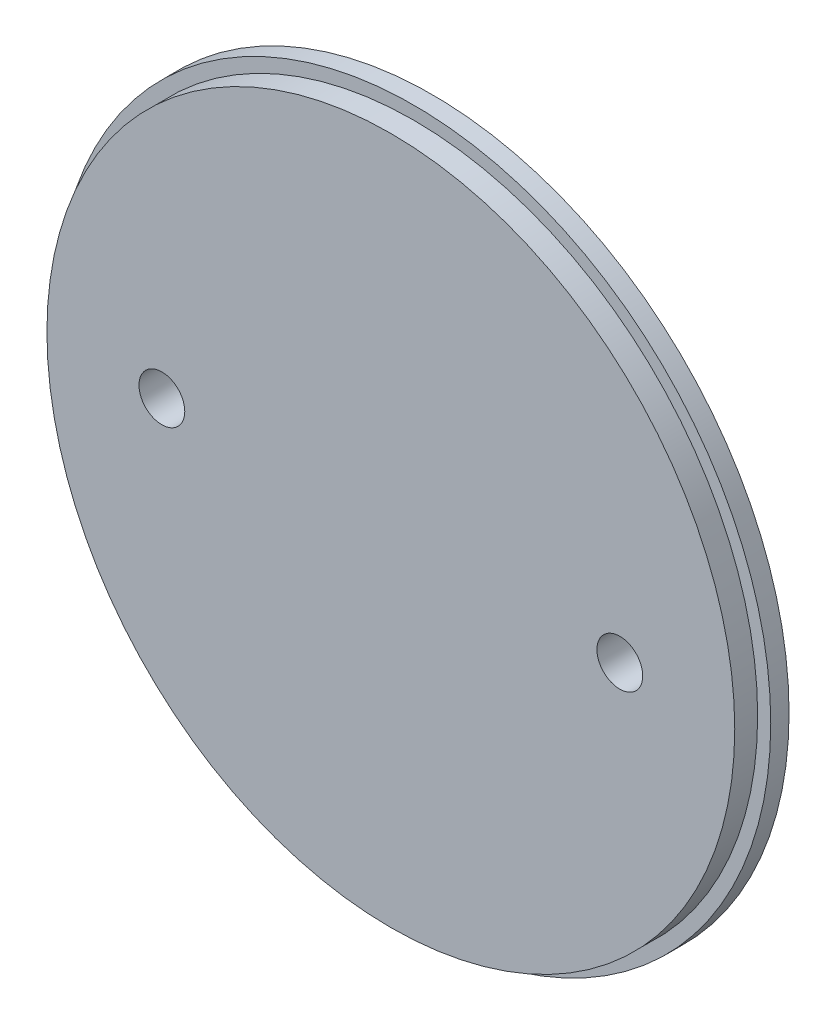
ISO-10303-21;
HEADER;
FILE_DESCRIPTION(('STEP AP214'),'2;1');
FILE_NAME('part.step','',(''),(''),'','','');
FILE_SCHEMA(('AUTOMOTIVE_DESIGN { 1 0 10303 214 1 1 1 1 }'));
ENDSEC;
DATA;
#1=APPLICATION_CONTEXT('core data for automotive mechanical design processes');
#2=APPLICATION_PROTOCOL_DEFINITION('international standard','automotive_design',2000,#1);
#3=PRODUCT_CONTEXT('',#1,'mechanical');
#4=PRODUCT('Part','Part','',(#3));
#5=PRODUCT_RELATED_PRODUCT_CATEGORY('part','',(#4));
#6=PRODUCT_DEFINITION_FORMATION('','',#4);
#7=PRODUCT_DEFINITION_CONTEXT('part definition',#1,'design');
#8=PRODUCT_DEFINITION('design','',#6,#7);
#9=PRODUCT_DEFINITION_SHAPE('','',#8);
#10=(LENGTH_UNIT() NAMED_UNIT(*) SI_UNIT(.MILLI.,.METRE.));
#11=(NAMED_UNIT(*) PLANE_ANGLE_UNIT() SI_UNIT($,.RADIAN.));
#12=(NAMED_UNIT(*) SI_UNIT($,.STERADIAN.) SOLID_ANGLE_UNIT());
#13=UNCERTAINTY_MEASURE_WITH_UNIT(LENGTH_MEASURE(1.E-05),#10,'distance_accuracy_value','');
#14=(GEOMETRIC_REPRESENTATION_CONTEXT(3) GLOBAL_UNCERTAINTY_ASSIGNED_CONTEXT((#13)) GLOBAL_UNIT_ASSIGNED_CONTEXT((#10,
#11,#12)) REPRESENTATION_CONTEXT('',''));
#15=CARTESIAN_POINT('',(0.,0.,0.));
#16=DIRECTION('',(0.,0.,1.));
#17=DIRECTION('',(1.,0.,0.));
#18=AXIS2_PLACEMENT_3D('',#15,#16,#17);
#19=CARTESIAN_POINT('',(0.,0.,2.54));
#20=DIRECTION('',(0.,0.,-1.));
#21=DIRECTION('',(-1.,0.,0.));
#22=AXIS2_PLACEMENT_3D('',#19,#20,#21);
#23=CYLINDRICAL_SURFACE('',#22,49.5046);
#24=CARTESIAN_POINT('',(0.,0.,2.54));
#25=DIRECTION('',(0.,0.,1.));
#26=DIRECTION('',(1.,0.,0.));
#27=AXIS2_PLACEMENT_3D('',#24,#25,#26);
#28=CIRCLE('',#27,49.5046);
#29=CARTESIAN_POINT('',(49.5046,0.,2.54));
#30=VERTEX_POINT('',#29);
#31=EDGE_CURVE('E40',#30,#30,#28,.T.);
#32=ORIENTED_EDGE('',*,*,#31,.F.);
#33=EDGE_LOOP('',(#32));
#34=FACE_BOUND('',#33,.T.);
#35=CARTESIAN_POINT('',(0.,0.,0.));
#36=DIRECTION('',(0.,0.,1.));
#37=DIRECTION('',(1.,0.,0.));
#38=AXIS2_PLACEMENT_3D('',#35,#36,#37);
#39=CIRCLE('',#38,49.5046);
#40=CARTESIAN_POINT('',(49.5046,0.,0.));
#41=VERTEX_POINT('',#40);
#42=EDGE_CURVE('E36',#41,#41,#39,.T.);
#43=ORIENTED_EDGE('',*,*,#42,.T.);
#44=EDGE_LOOP('',(#43));
#45=FACE_BOUND('',#44,.T.);
#46=ADVANCED_FACE('F33',(#34,#45),#23,.T.);
#47=CARTESIAN_POINT('',(0.,0.,2.54));
#48=DIRECTION('',(0.,0.,1.));
#49=DIRECTION('',(1.,0.,0.));
#50=AXIS2_PLACEMENT_3D('',#47,#48,#49);
#51=PLANE('',#50);
#52=CARTESIAN_POINT('',(0.,0.,2.54));
#53=DIRECTION('',(0.,0.,1.));
#54=DIRECTION('',(1.,0.,0.));
#55=AXIS2_PLACEMENT_3D('',#52,#53,#54);
#56=CIRCLE('',#55,47.6885);
#57=CARTESIAN_POINT('',(47.6885,0.,2.54));
#58=VERTEX_POINT('',#57);
#59=EDGE_CURVE('E10',#58,#58,#56,.T.);
#60=ORIENTED_EDGE('',*,*,#59,.F.);
#61=EDGE_LOOP('',(#60));
#62=FACE_BOUND('',#61,.T.);
#63=ORIENTED_EDGE('',*,*,#31,.T.);
#64=EDGE_LOOP('',(#63));
#65=FACE_BOUND('',#64,.T.);
#66=ADVANCED_FACE('F86',(#62,#65),#51,.T.);
#67=CARTESIAN_POINT('',(0.,0.,0.));
#68=DIRECTION('',(0.,0.,1.));
#69=DIRECTION('',(1.,0.,0.));
#70=AXIS2_PLACEMENT_3D('',#67,#68,#69);
#71=PLANE('',#70);
#72=CARTESIAN_POINT('',(-31.75,0.,0.));
#73=DIRECTION('',(0.,0.,1.));
#74=DIRECTION('',(1.,0.,0.));
#75=AXIS2_PLACEMENT_3D('',#72,#73,#74);
#76=CIRCLE('',#75,3.175);
#77=CARTESIAN_POINT('',(-28.575,0.,0.));
#78=VERTEX_POINT('',#77);
#79=EDGE_CURVE('E49',#78,#78,#76,.T.);
#80=ORIENTED_EDGE('',*,*,#79,.T.);
#81=EDGE_LOOP('',(#80));
#82=FACE_BOUND('',#81,.T.);
#83=CARTESIAN_POINT('',(31.75,0.,0.));
#84=DIRECTION('',(0.,0.,1.));
#85=DIRECTION('',(1.,0.,0.));
#86=AXIS2_PLACEMENT_3D('',#83,#84,#85);
#87=CIRCLE('',#86,3.175);
#88=CARTESIAN_POINT('',(34.925,0.,0.));
#89=VERTEX_POINT('',#88);
#90=EDGE_CURVE('E53',#89,#89,#87,.T.);
#91=ORIENTED_EDGE('',*,*,#90,.T.);
#92=EDGE_LOOP('',(#91));
#93=FACE_BOUND('',#92,.T.);
#94=ORIENTED_EDGE('',*,*,#42,.F.);
#95=EDGE_LOOP('',(#94));
#96=FACE_BOUND('',#95,.T.);
#97=ADVANCED_FACE('F62',(#82,#93,#96),#71,.F.);
#98=CARTESIAN_POINT('',(0.,0.,5.715));
#99=DIRECTION('',(0.,0.,-1.));
#100=DIRECTION('',(-1.,0.,0.));
#101=AXIS2_PLACEMENT_3D('',#98,#99,#100);
#102=CYLINDRICAL_SURFACE('',#101,47.6885);
#103=CARTESIAN_POINT('',(0.,0.,5.715));
#104=DIRECTION('',(0.,0.,1.));
#105=DIRECTION('',(1.,0.,0.));
#106=AXIS2_PLACEMENT_3D('',#103,#104,#105);
#107=CIRCLE('',#106,47.6885);
#108=CARTESIAN_POINT('',(47.6885,0.,5.715));
#109=VERTEX_POINT('',#108);
#110=EDGE_CURVE('E46',#109,#109,#107,.T.);
#111=ORIENTED_EDGE('',*,*,#110,.F.);
#112=EDGE_LOOP('',(#111));
#113=FACE_BOUND('',#112,.T.);
#114=ORIENTED_EDGE('',*,*,#59,.T.);
#115=EDGE_LOOP('',(#114));
#116=FACE_BOUND('',#115,.T.);
#117=ADVANCED_FACE('F75',(#113,#116),#102,.T.);
#118=CARTESIAN_POINT('',(0.,0.,5.715));
#119=DIRECTION('',(0.,0.,1.));
#120=DIRECTION('',(1.,0.,0.));
#121=AXIS2_PLACEMENT_3D('',#118,#119,#120);
#122=PLANE('',#121);
#123=CARTESIAN_POINT('',(-31.75,0.,5.715));
#124=DIRECTION('',(0.,0.,1.));
#125=DIRECTION('',(1.,0.,0.));
#126=AXIS2_PLACEMENT_3D('',#123,#124,#125);
#127=CIRCLE('',#126,3.175);
#128=CARTESIAN_POINT('',(-28.575,0.,5.715));
#129=VERTEX_POINT('',#128);
#130=EDGE_CURVE('E56',#129,#129,#127,.T.);
#131=ORIENTED_EDGE('',*,*,#130,.F.);
#132=EDGE_LOOP('',(#131));
#133=FACE_BOUND('',#132,.T.);
#134=CARTESIAN_POINT('',(31.75,0.,5.715));
#135=DIRECTION('',(0.,0.,1.));
#136=DIRECTION('',(1.,0.,0.));
#137=AXIS2_PLACEMENT_3D('',#134,#135,#136);
#138=CIRCLE('',#137,3.175);
#139=CARTESIAN_POINT('',(34.925,0.,5.715));
#140=VERTEX_POINT('',#139);
#141=EDGE_CURVE('E50',#140,#140,#138,.T.);
#142=ORIENTED_EDGE('',*,*,#141,.F.);
#143=EDGE_LOOP('',(#142));
#144=FACE_BOUND('',#143,.T.);
#145=ORIENTED_EDGE('',*,*,#110,.T.);
#146=EDGE_LOOP('',(#145));
#147=FACE_BOUND('',#146,.T.);
#148=ADVANCED_FACE('F72',(#133,#144,#147),#122,.T.);
#149=CARTESIAN_POINT('',(31.75,0.,0.));
#150=DIRECTION('',(0.,0.,1.));
#151=DIRECTION('',(1.,0.,0.));
#152=AXIS2_PLACEMENT_3D('',#149,#150,#151);
#153=CYLINDRICAL_SURFACE('',#152,3.175);
#154=ORIENTED_EDGE('',*,*,#90,.F.);
#155=EDGE_LOOP('',(#154));
#156=FACE_BOUND('',#155,.T.);
#157=ORIENTED_EDGE('',*,*,#141,.T.);
#158=EDGE_LOOP('',(#157));
#159=FACE_BOUND('',#158,.T.);
#160=ADVANCED_FACE('F68',(#156,#159),#153,.F.);
#161=CARTESIAN_POINT('',(-31.75,0.,0.));
#162=DIRECTION('',(0.,0.,1.));
#163=DIRECTION('',(1.,0.,0.));
#164=AXIS2_PLACEMENT_3D('',#161,#162,#163);
#165=CYLINDRICAL_SURFACE('',#164,3.175);
#166=ORIENTED_EDGE('',*,*,#79,.F.);
#167=EDGE_LOOP('',(#166));
#168=FACE_BOUND('',#167,.T.);
#169=ORIENTED_EDGE('',*,*,#130,.T.);
#170=EDGE_LOOP('',(#169));
#171=FACE_BOUND('',#170,.T.);
#172=ADVANCED_FACE('F65',(#168,#171),#165,.F.);
#173=CLOSED_SHELL('',(#46,#66,#97,#117,#148,#160,#172));
#174=MANIFOLD_SOLID_BREP('B2',#173);
#175=ADVANCED_BREP_SHAPE_REPRESENTATION('',(#18,#174),#14);
#176=SHAPE_DEFINITION_REPRESENTATION(#9,#175);
ENDSEC;
END-ISO-10303-21;
